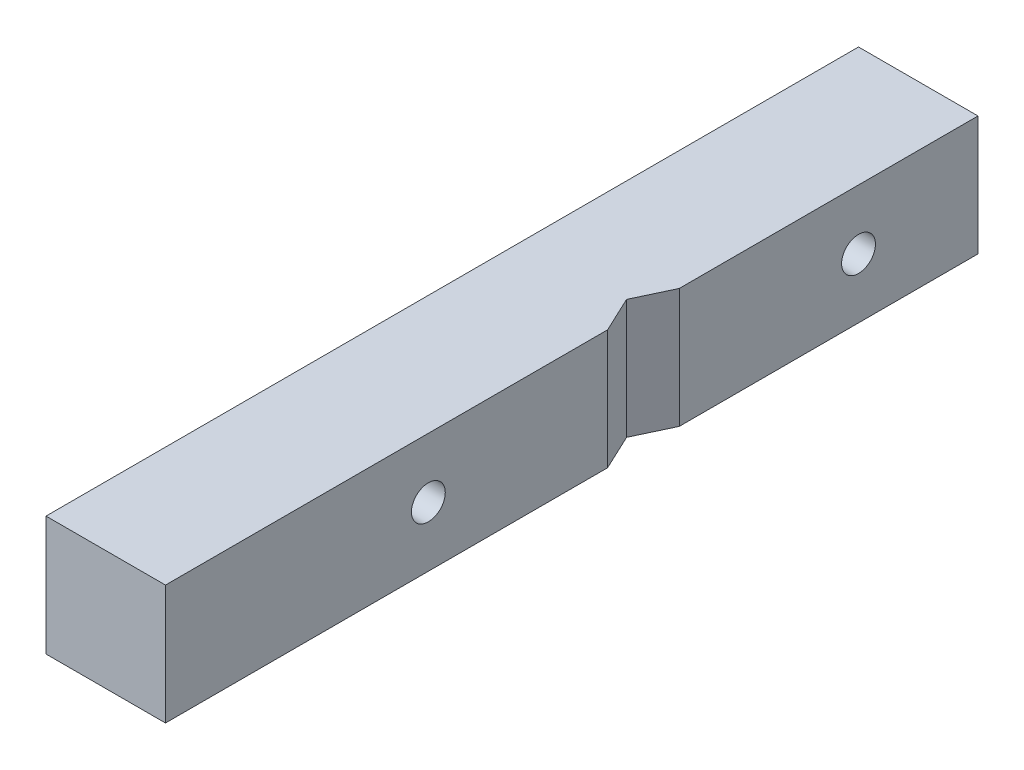
ISO-10303-21;
HEADER;
FILE_DESCRIPTION(('STEP AP214'),'2;1');
FILE_NAME('part.step','',(''),(''),'','','');
FILE_SCHEMA(('AUTOMOTIVE_DESIGN { 1 0 10303 214 1 1 1 1 }'));
ENDSEC;
DATA;
#1=APPLICATION_CONTEXT('core data for automotive mechanical design processes');
#2=APPLICATION_PROTOCOL_DEFINITION('international standard','automotive_design',2000,#1);
#3=PRODUCT_CONTEXT('',#1,'mechanical');
#4=PRODUCT('Part','Part','',(#3));
#5=PRODUCT_RELATED_PRODUCT_CATEGORY('part','',(#4));
#6=PRODUCT_DEFINITION_FORMATION('','',#4);
#7=PRODUCT_DEFINITION_CONTEXT('part definition',#1,'design');
#8=PRODUCT_DEFINITION('design','',#6,#7);
#9=PRODUCT_DEFINITION_SHAPE('','',#8);
#10=(LENGTH_UNIT() NAMED_UNIT(*) SI_UNIT(.MILLI.,.METRE.));
#11=(NAMED_UNIT(*) PLANE_ANGLE_UNIT() SI_UNIT($,.RADIAN.));
#12=(NAMED_UNIT(*) SI_UNIT($,.STERADIAN.) SOLID_ANGLE_UNIT());
#13=UNCERTAINTY_MEASURE_WITH_UNIT(LENGTH_MEASURE(1.E-05),#10,'distance_accuracy_value','');
#14=(GEOMETRIC_REPRESENTATION_CONTEXT(3) GLOBAL_UNCERTAINTY_ASSIGNED_CONTEXT((#13)) GLOBAL_UNIT_ASSIGNED_CONTEXT((#10,
#11,#12)) REPRESENTATION_CONTEXT('',''));
#15=CARTESIAN_POINT('',(0.,0.,0.));
#16=DIRECTION('',(0.,0.,1.));
#17=DIRECTION('',(1.,0.,0.));
#18=AXIS2_PLACEMENT_3D('',#15,#16,#17);
#19=CARTESIAN_POINT('',(7.9375,-7.9375,53.975));
#20=DIRECTION('',(0.,1.,0.));
#21=DIRECTION('',(-1.,0.,0.));
#22=AXIS2_PLACEMENT_3D('',#19,#20,#21);
#23=PLANE('',#22);
#24=DIRECTION('',(0.425234482200259,0.,-0.905083220012324));
#25=VECTOR('',#24,1.);
#26=CARTESIAN_POINT('',(-18.3348654759184,-7.9375,41.631476794282));
#27=LINE('',#26,#25);
#28=CARTESIAN_POINT('',(5.69993866121929,-7.9375,-9.52500000000001));
#29=VERTEX_POINT('',#28);
#30=CARTESIAN_POINT('',(7.9375,-7.9375,-14.2875));
#31=VERTEX_POINT('',#30);
#32=EDGE_CURVE('E52',#29,#31,#27,.T.);
#33=ORIENTED_EDGE('',*,*,#32,.F.);
#34=DIRECTION('',(-0.425234482200259,0.,-0.905083220012325));
#35=VECTOR('',#34,1.);
#36=CARTESIAN_POINT('',(30.5439540141623,-7.9375,43.3538288694985));
#37=LINE('',#36,#35);
#38=CARTESIAN_POINT('',(7.9375,-7.9375,-4.7625));
#39=VERTEX_POINT('',#38);
#40=EDGE_CURVE('E148',#39,#29,#37,.T.);
#41=ORIENTED_EDGE('',*,*,#40,.F.);
#42=DIRECTION('',(0.,0.,-1.));
#43=VECTOR('',#42,1.);
#44=CARTESIAN_POINT('',(7.9375,-7.9375,53.975));
#45=LINE('',#44,#43);
#46=CARTESIAN_POINT('',(7.9375,-7.9375,53.975));
#47=VERTEX_POINT('',#46);
#48=EDGE_CURVE('E113',#47,#39,#45,.T.);
#49=ORIENTED_EDGE('',*,*,#48,.F.);
#50=DIRECTION('',(1.,0.,0.));
#51=VECTOR('',#50,1.);
#52=CARTESIAN_POINT('',(7.9375,-7.9375,53.975));
#53=LINE('',#52,#51);
#54=CARTESIAN_POINT('',(-7.9375,-7.9375,53.975));
#55=VERTEX_POINT('',#54);
#56=EDGE_CURVE('E143',#55,#47,#53,.T.);
#57=ORIENTED_EDGE('',*,*,#56,.F.);
#58=DIRECTION('',(0.,0.,-1.));
#59=VECTOR('',#58,1.);
#60=CARTESIAN_POINT('',(-7.9375,-7.9375,53.975));
#61=LINE('',#60,#59);
#62=CARTESIAN_POINT('',(-7.9375,-7.9375,-53.975));
#63=VERTEX_POINT('',#62);
#64=EDGE_CURVE('E120',#55,#63,#61,.T.);
#65=ORIENTED_EDGE('',*,*,#64,.T.);
#66=DIRECTION('',(1.,0.,0.));
#67=VECTOR('',#66,1.);
#68=CARTESIAN_POINT('',(7.9375,-7.9375,-53.975));
#69=LINE('',#68,#67);
#70=CARTESIAN_POINT('',(7.9375,-7.9375,-53.975));
#71=VERTEX_POINT('',#70);
#72=EDGE_CURVE('E134',#63,#71,#69,.T.);
#73=ORIENTED_EDGE('',*,*,#72,.T.);
#74=EDGE_CURVE('E105',#31,#71,#45,.T.);
#75=ORIENTED_EDGE('',*,*,#74,.F.);
#76=EDGE_LOOP('',(#33,#41,#49,#57,#65,#73,#75));
#77=FACE_BOUND('',#76,.T.);
#78=ADVANCED_FACE('F37',(#77),#23,.F.);
#79=CARTESIAN_POINT('',(7.9375,-7.9375,53.975));
#80=DIRECTION('',(-1.,0.,0.));
#81=DIRECTION('',(0.,0.,1.));
#82=AXIS2_PLACEMENT_3D('',#79,#80,#81);
#83=PLANE('',#82);
#84=CARTESIAN_POINT('',(7.9375,0.,-38.1));
#85=DIRECTION('',(1.,0.,0.));
#86=DIRECTION('',(0.,0.,-1.));
#87=AXIS2_PLACEMENT_3D('',#84,#85,#86);
#88=CIRCLE('',#87,2.24789999999999);
#89=CARTESIAN_POINT('',(7.9375,0.,-40.3479));
#90=VERTEX_POINT('',#89);
#91=EDGE_CURVE('E161',#90,#90,#88,.T.);
#92=ORIENTED_EDGE('',*,*,#91,.F.);
#93=EDGE_LOOP('',(#92));
#94=FACE_BOUND('',#93,.T.);
#95=DIRECTION('',(0.,-1.,0.));
#96=VECTOR('',#95,1.);
#97=CARTESIAN_POINT('',(7.9375,165.606058123846,-14.2875));
#98=LINE('',#97,#96);
#99=CARTESIAN_POINT('',(7.9375,7.9375,-14.2875));
#100=VERTEX_POINT('',#99);
#101=EDGE_CURVE('E60',#100,#31,#98,.T.);
#102=ORIENTED_EDGE('',*,*,#101,.T.);
#103=ORIENTED_EDGE('',*,*,#74,.T.);
#104=DIRECTION('',(0.,1.,0.));
#105=VECTOR('',#104,1.);
#106=CARTESIAN_POINT('',(7.9375,-7.9375,-53.975));
#107=LINE('',#106,#105);
#108=CARTESIAN_POINT('',(7.9375,7.9375,-53.975));
#109=VERTEX_POINT('',#108);
#110=EDGE_CURVE('E131',#71,#109,#107,.T.);
#111=ORIENTED_EDGE('',*,*,#110,.T.);
#112=DIRECTION('',(0.,0.,-1.));
#113=VECTOR('',#112,1.);
#114=CARTESIAN_POINT('',(7.9375,7.9375,53.975));
#115=LINE('',#114,#113);
#116=EDGE_CURVE('E106',#100,#109,#115,.T.);
#117=ORIENTED_EDGE('',*,*,#116,.F.);
#118=EDGE_LOOP('',(#102,#103,#111,#117));
#119=FACE_BOUND('',#118,.T.);
#120=ADVANCED_FACE('F167',(#94,#119),#83,.F.);
#121=CARTESIAN_POINT('',(7.9375,0.,19.05));
#122=DIRECTION('',(1.,0.,0.));
#123=DIRECTION('',(0.,0.,-1.));
#124=AXIS2_PLACEMENT_3D('',#121,#122,#123);
#125=CIRCLE('',#124,2.24789999999999);
#126=CARTESIAN_POINT('',(7.9375,0.,16.8021));
#127=VERTEX_POINT('',#126);
#128=EDGE_CURVE('E155',#127,#127,#125,.T.);
#129=ORIENTED_EDGE('',*,*,#128,.F.);
#130=EDGE_LOOP('',(#129));
#131=FACE_BOUND('',#130,.T.);
#132=DIRECTION('',(0.,-1.,0.));
#133=VECTOR('',#132,1.);
#134=CARTESIAN_POINT('',(7.9375,165.606058123846,-4.76250000000001));
#135=LINE('',#134,#133);
#136=CARTESIAN_POINT('',(7.9375,7.93750000000004,-4.76250000000001));
#137=VERTEX_POINT('',#136);
#138=EDGE_CURVE('E110',#137,#39,#135,.T.);
#139=ORIENTED_EDGE('',*,*,#138,.F.);
#140=CARTESIAN_POINT('',(7.9375,7.9375,53.975));
#141=VERTEX_POINT('',#140);
#142=EDGE_CURVE('E97',#141,#137,#115,.T.);
#143=ORIENTED_EDGE('',*,*,#142,.F.);
#144=DIRECTION('',(0.,1.,0.));
#145=VECTOR('',#144,1.);
#146=CARTESIAN_POINT('',(7.9375,-7.9375,53.975));
#147=LINE('',#146,#145);
#148=EDGE_CURVE('E141',#47,#141,#147,.T.);
#149=ORIENTED_EDGE('',*,*,#148,.F.);
#150=ORIENTED_EDGE('',*,*,#48,.T.);
#151=EDGE_LOOP('',(#139,#143,#149,#150));
#152=FACE_BOUND('',#151,.T.);
#153=ADVANCED_FACE('F111',(#131,#152),#83,.F.);
#154=CARTESIAN_POINT('',(7.9375,7.9375,53.975));
#155=DIRECTION('',(0.,-1.,0.));
#156=DIRECTION('',(0.,0.,-1.));
#157=AXIS2_PLACEMENT_3D('',#154,#155,#156);
#158=PLANE('',#157);
#159=DIRECTION('',(-0.425234482200259,0.,0.905083220012324));
#160=VECTOR('',#159,1.);
#161=CARTESIAN_POINT('',(-18.3348654759184,7.9375,41.631476794282));
#162=LINE('',#161,#160);
#163=CARTESIAN_POINT('',(5.69993866121929,7.9375,-9.52500000000001));
#164=VERTEX_POINT('',#163);
#165=EDGE_CURVE('E11',#100,#164,#162,.T.);
#166=ORIENTED_EDGE('',*,*,#165,.F.);
#167=ORIENTED_EDGE('',*,*,#116,.T.);
#168=DIRECTION('',(-1.,0.,0.));
#169=VECTOR('',#168,1.);
#170=CARTESIAN_POINT('',(7.9375,7.9375,-53.975));
#171=LINE('',#170,#169);
#172=CARTESIAN_POINT('',(-7.9375,7.9375,-53.975));
#173=VERTEX_POINT('',#172);
#174=EDGE_CURVE('E128',#109,#173,#171,.T.);
#175=ORIENTED_EDGE('',*,*,#174,.T.);
#176=DIRECTION('',(0.,0.,-1.));
#177=VECTOR('',#176,1.);
#178=CARTESIAN_POINT('',(-7.9375,7.9375,53.975));
#179=LINE('',#178,#177);
#180=CARTESIAN_POINT('',(-7.9375,7.9375,53.975));
#181=VERTEX_POINT('',#180);
#182=EDGE_CURVE('E125',#181,#173,#179,.T.);
#183=ORIENTED_EDGE('',*,*,#182,.F.);
#184=DIRECTION('',(-1.,0.,0.));
#185=VECTOR('',#184,1.);
#186=CARTESIAN_POINT('',(7.9375,7.9375,53.975));
#187=LINE('',#186,#185);
#188=EDGE_CURVE('E102',#141,#181,#187,.T.);
#189=ORIENTED_EDGE('',*,*,#188,.F.);
#190=ORIENTED_EDGE('',*,*,#142,.T.);
#191=DIRECTION('',(0.425234482200259,0.,0.905083220012325));
#192=VECTOR('',#191,1.);
#193=CARTESIAN_POINT('',(30.5439540141623,7.9375,43.3538288694985));
#194=LINE('',#193,#192);
#195=EDGE_CURVE('E45',#164,#137,#194,.T.);
#196=ORIENTED_EDGE('',*,*,#195,.F.);
#197=EDGE_LOOP('',(#166,#167,#175,#183,#189,#190,#196));
#198=FACE_BOUND('',#197,.T.);
#199=ADVANCED_FACE('F99',(#198),#158,.F.);
#200=CARTESIAN_POINT('',(-7.9375,-7.9375,53.975));
#201=DIRECTION('',(1.,0.,0.));
#202=DIRECTION('',(0.,0.,-1.));
#203=AXIS2_PLACEMENT_3D('',#200,#201,#202);
#204=PLANE('',#203);
#205=CARTESIAN_POINT('',(-7.9375,0.,-38.1));
#206=DIRECTION('',(1.,0.,0.));
#207=DIRECTION('',(0.,0.,-1.));
#208=AXIS2_PLACEMENT_3D('',#205,#206,#207);
#209=CIRCLE('',#208,2.24789999999999);
#210=CARTESIAN_POINT('',(-7.9375,0.,-40.3479));
#211=VERTEX_POINT('',#210);
#212=EDGE_CURVE('E158',#211,#211,#209,.T.);
#213=ORIENTED_EDGE('',*,*,#212,.T.);
#214=EDGE_LOOP('',(#213));
#215=FACE_BOUND('',#214,.T.);
#216=CARTESIAN_POINT('',(-7.9375,0.,19.05));
#217=DIRECTION('',(1.,0.,0.));
#218=DIRECTION('',(0.,0.,-1.));
#219=AXIS2_PLACEMENT_3D('',#216,#217,#218);
#220=CIRCLE('',#219,2.24789999999999);
#221=CARTESIAN_POINT('',(-7.9375,0.,16.8021));
#222=VERTEX_POINT('',#221);
#223=EDGE_CURVE('E151',#222,#222,#220,.T.);
#224=ORIENTED_EDGE('',*,*,#223,.T.);
#225=EDGE_LOOP('',(#224));
#226=FACE_BOUND('',#225,.T.);
#227=DIRECTION('',(0.,-1.,0.));
#228=VECTOR('',#227,1.);
#229=CARTESIAN_POINT('',(-7.9375,-7.9375,-53.975));
#230=LINE('',#229,#228);
#231=EDGE_CURVE('E137',#173,#63,#230,.T.);
#232=ORIENTED_EDGE('',*,*,#231,.T.);
#233=ORIENTED_EDGE('',*,*,#64,.F.);
#234=DIRECTION('',(0.,-1.,0.));
#235=VECTOR('',#234,1.);
#236=CARTESIAN_POINT('',(-7.9375,-7.9375,53.975));
#237=LINE('',#236,#235);
#238=EDGE_CURVE('E130',#181,#55,#237,.T.);
#239=ORIENTED_EDGE('',*,*,#238,.F.);
#240=ORIENTED_EDGE('',*,*,#182,.T.);
#241=EDGE_LOOP('',(#232,#233,#239,#240));
#242=FACE_BOUND('',#241,.T.);
#243=ADVANCED_FACE('F39',(#215,#226,#242),#204,.F.);
#244=CARTESIAN_POINT('',(0.,0.,53.975));
#245=DIRECTION('',(0.,0.,1.));
#246=DIRECTION('',(1.,0.,0.));
#247=AXIS2_PLACEMENT_3D('',#244,#245,#246);
#248=PLANE('',#247);
#249=ORIENTED_EDGE('',*,*,#238,.T.);
#250=ORIENTED_EDGE('',*,*,#56,.T.);
#251=ORIENTED_EDGE('',*,*,#148,.T.);
#252=ORIENTED_EDGE('',*,*,#188,.T.);
#253=EDGE_LOOP('',(#249,#250,#251,#252));
#254=FACE_BOUND('',#253,.T.);
#255=ADVANCED_FACE('F182',(#254),#248,.T.);
#256=CARTESIAN_POINT('',(0.,0.,-53.975));
#257=DIRECTION('',(0.,0.,1.));
#258=DIRECTION('',(1.,0.,0.));
#259=AXIS2_PLACEMENT_3D('',#256,#257,#258);
#260=PLANE('',#259);
#261=ORIENTED_EDGE('',*,*,#231,.F.);
#262=ORIENTED_EDGE('',*,*,#174,.F.);
#263=ORIENTED_EDGE('',*,*,#110,.F.);
#264=ORIENTED_EDGE('',*,*,#72,.F.);
#265=EDGE_LOOP('',(#261,#262,#263,#264));
#266=FACE_BOUND('',#265,.T.);
#267=ADVANCED_FACE('F178',(#266),#260,.F.);
#268=CARTESIAN_POINT('',(7.9375,165.606058123846,-14.2875));
#269=DIRECTION('',(0.905083220012324,0.,0.425234482200259));
#270=DIRECTION('',(0.425234482200259,0.,-0.905083220012324));
#271=AXIS2_PLACEMENT_3D('',#268,#269,#270);
#272=PLANE('',#271);
#273=DIRECTION('',(0.,-1.,0.));
#274=VECTOR('',#273,1.);
#275=CARTESIAN_POINT('',(5.69993866121929,165.606058123846,-9.52500000000001));
#276=LINE('',#275,#274);
#277=EDGE_CURVE('E115',#164,#29,#276,.T.);
#278=ORIENTED_EDGE('',*,*,#277,.T.);
#279=ORIENTED_EDGE('',*,*,#32,.T.);
#280=ORIENTED_EDGE('',*,*,#101,.F.);
#281=ORIENTED_EDGE('',*,*,#165,.T.);
#282=EDGE_LOOP('',(#278,#279,#280,#281));
#283=FACE_BOUND('',#282,.T.);
#284=ADVANCED_FACE('F181',(#283),#272,.T.);
#285=CARTESIAN_POINT('',(5.69993866121929,165.606058123846,-9.52500000000001));
#286=DIRECTION('',(0.905083220012324,0.,-0.425234482200259));
#287=DIRECTION('',(-0.425234482200259,0.,-0.905083220012325));
#288=AXIS2_PLACEMENT_3D('',#285,#286,#287);
#289=PLANE('',#288);
#290=ORIENTED_EDGE('',*,*,#138,.T.);
#291=ORIENTED_EDGE('',*,*,#40,.T.);
#292=ORIENTED_EDGE('',*,*,#277,.F.);
#293=ORIENTED_EDGE('',*,*,#195,.T.);
#294=EDGE_LOOP('',(#290,#291,#292,#293));
#295=FACE_BOUND('',#294,.T.);
#296=ADVANCED_FACE('F118',(#295),#289,.T.);
#297=CARTESIAN_POINT('',(7.9375,0.,19.05));
#298=DIRECTION('',(1.,0.,0.));
#299=DIRECTION('',(0.,0.,-1.));
#300=AXIS2_PLACEMENT_3D('',#297,#298,#299);
#301=CYLINDRICAL_SURFACE('',#300,2.24789999999999);
#302=ORIENTED_EDGE('',*,*,#223,.F.);
#303=EDGE_LOOP('',(#302));
#304=FACE_BOUND('',#303,.T.);
#305=ORIENTED_EDGE('',*,*,#128,.T.);
#306=EDGE_LOOP('',(#305));
#307=FACE_BOUND('',#306,.T.);
#308=ADVANCED_FACE('F192',(#304,#307),#301,.F.);
#309=CARTESIAN_POINT('',(7.9375,0.,-38.1));
#310=DIRECTION('',(1.,0.,0.));
#311=DIRECTION('',(0.,0.,-1.));
#312=AXIS2_PLACEMENT_3D('',#309,#310,#311);
#313=CYLINDRICAL_SURFACE('',#312,2.24789999999999);
#314=ORIENTED_EDGE('',*,*,#212,.F.);
#315=EDGE_LOOP('',(#314));
#316=FACE_BOUND('',#315,.T.);
#317=ORIENTED_EDGE('',*,*,#91,.T.);
#318=EDGE_LOOP('',(#317));
#319=FACE_BOUND('',#318,.T.);
#320=ADVANCED_FACE('F165',(#316,#319),#313,.F.);
#321=CLOSED_SHELL('',(#78,#120,#153,#199,#243,#255,#267,#284,#296,#308,#320));
#322=MANIFOLD_SOLID_BREP('B2',#321);
#323=ADVANCED_BREP_SHAPE_REPRESENTATION('',(#18,#322),#14);
#324=SHAPE_DEFINITION_REPRESENTATION(#9,#323);
ENDSEC;
END-ISO-10303-21;
